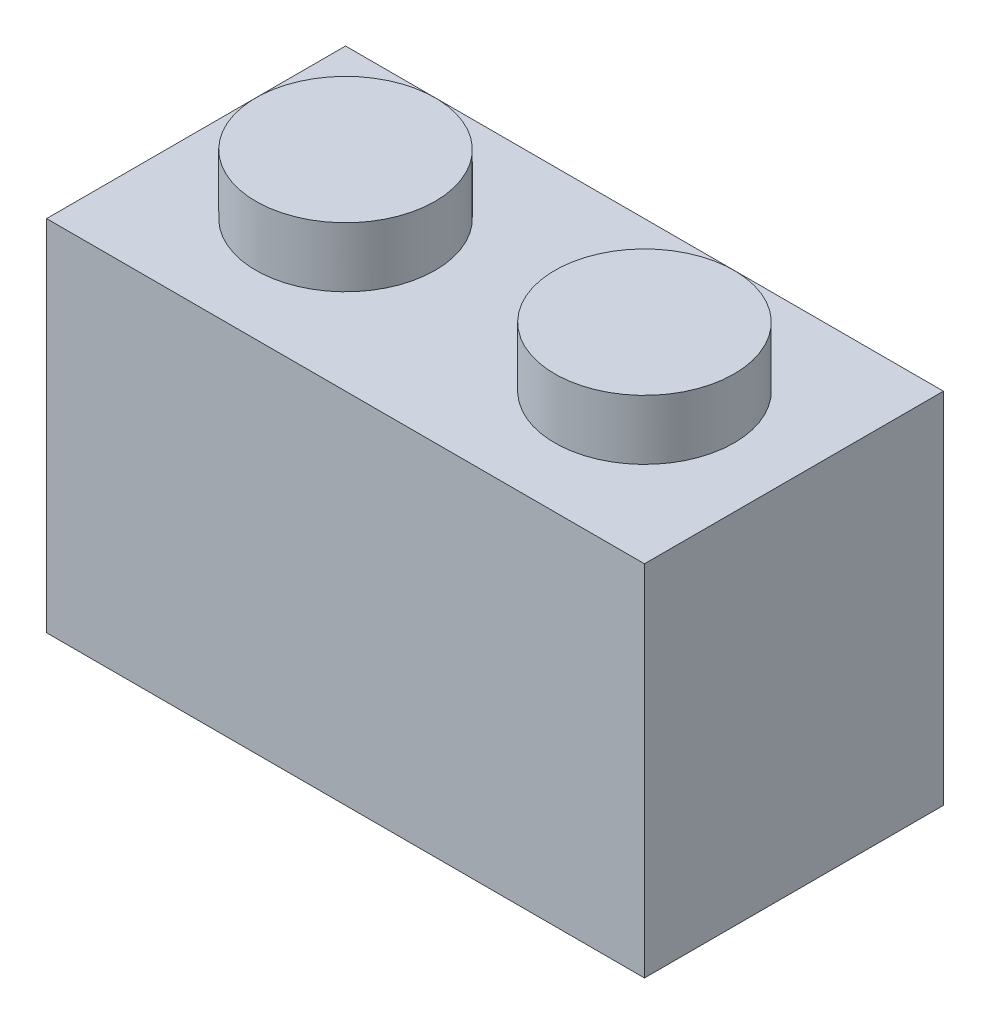
ISO-10303-21;
HEADER;
FILE_DESCRIPTION(('STEP AP214'),'2;1');
FILE_NAME('part.step','',(''),(''),'','','');
FILE_SCHEMA(('AUTOMOTIVE_DESIGN { 1 0 10303 214 1 1 1 1 }'));
ENDSEC;
DATA;
#1=APPLICATION_CONTEXT('core data for automotive mechanical design processes');
#2=APPLICATION_PROTOCOL_DEFINITION('international standard','automotive_design',2000,#1);
#3=PRODUCT_CONTEXT('',#1,'mechanical');
#4=PRODUCT('Part','Part','',(#3));
#5=PRODUCT_RELATED_PRODUCT_CATEGORY('part','',(#4));
#6=PRODUCT_DEFINITION_FORMATION('','',#4);
#7=PRODUCT_DEFINITION_CONTEXT('part definition',#1,'design');
#8=PRODUCT_DEFINITION('design','',#6,#7);
#9=PRODUCT_DEFINITION_SHAPE('','',#8);
#10=(LENGTH_UNIT() NAMED_UNIT(*) SI_UNIT(.MILLI.,.METRE.));
#11=(NAMED_UNIT(*) PLANE_ANGLE_UNIT() SI_UNIT($,.RADIAN.));
#12=(NAMED_UNIT(*) SI_UNIT($,.STERADIAN.) SOLID_ANGLE_UNIT());
#13=UNCERTAINTY_MEASURE_WITH_UNIT(LENGTH_MEASURE(1.E-05),#10,'distance_accuracy_value','');
#14=(GEOMETRIC_REPRESENTATION_CONTEXT(3) GLOBAL_UNCERTAINTY_ASSIGNED_CONTEXT((#13)) GLOBAL_UNIT_ASSIGNED_CONTEXT((#10,
#11,#12)) REPRESENTATION_CONTEXT('',''));
#15=CARTESIAN_POINT('',(0.,0.,0.));
#16=DIRECTION('',(0.,0.,1.));
#17=DIRECTION('',(1.,0.,0.));
#18=AXIS2_PLACEMENT_3D('',#15,#16,#17);
#19=CARTESIAN_POINT('',(12.,4.8,0.));
#20=DIRECTION('',(-1.,0.,0.));
#21=DIRECTION('',(0.,0.,1.));
#22=AXIS2_PLACEMENT_3D('',#19,#20,#21);
#23=PLANE('',#22);
#24=DIRECTION('',(0.,0.,-1.));
#25=VECTOR('',#24,1.);
#26=CARTESIAN_POINT('',(12.,0.,0.));
#27=LINE('',#26,#25);
#28=CARTESIAN_POINT('',(12.,0.,4.));
#29=VERTEX_POINT('',#28);
#30=CARTESIAN_POINT('',(12.,0.,-4.));
#31=VERTEX_POINT('',#30);
#32=EDGE_CURVE('E98',#29,#31,#27,.T.);
#33=ORIENTED_EDGE('',*,*,#32,.T.);
#34=DIRECTION('',(0.,-1.,0.));
#35=VECTOR('',#34,1.);
#36=CARTESIAN_POINT('',(12.,4.8,-4.));
#37=LINE('',#36,#35);
#38=CARTESIAN_POINT('',(12.,9.6,-4.));
#39=VERTEX_POINT('',#38);
#40=EDGE_CURVE('E111',#39,#31,#37,.T.);
#41=ORIENTED_EDGE('',*,*,#40,.F.);
#42=DIRECTION('',(0.,0.,-1.));
#43=VECTOR('',#42,1.);
#44=CARTESIAN_POINT('',(12.,9.6,0.));
#45=LINE('',#44,#43);
#46=CARTESIAN_POINT('',(12.,9.6,4.));
#47=VERTEX_POINT('',#46);
#48=EDGE_CURVE('E11',#47,#39,#45,.T.);
#49=ORIENTED_EDGE('',*,*,#48,.F.);
#50=DIRECTION('',(0.,1.,0.));
#51=VECTOR('',#50,1.);
#52=CARTESIAN_POINT('',(12.,4.8,4.));
#53=LINE('',#52,#51);
#54=EDGE_CURVE('E93',#29,#47,#53,.T.);
#55=ORIENTED_EDGE('',*,*,#54,.F.);
#56=EDGE_LOOP('',(#33,#41,#49,#55));
#57=FACE_BOUND('',#56,.T.);
#58=ADVANCED_FACE('F17',(#57),#23,.F.);
#59=CARTESIAN_POINT('',(4.,9.6,0.));
#60=DIRECTION('',(0.,-1.,0.));
#61=DIRECTION('',(0.,0.,-1.));
#62=AXIS2_PLACEMENT_3D('',#59,#60,#61);
#63=PLANE('',#62);
#64=ORIENTED_EDGE('',*,*,#48,.T.);
#65=DIRECTION('',(1.,0.,0.));
#66=VECTOR('',#65,1.);
#67=CARTESIAN_POINT('',(4.,9.6,-4.));
#68=LINE('',#67,#66);
#69=CARTESIAN_POINT('',(-4.,9.6,-4.));
#70=VERTEX_POINT('',#69);
#71=EDGE_CURVE('E103',#70,#39,#68,.T.);
#72=ORIENTED_EDGE('',*,*,#71,.F.);
#73=DIRECTION('',(0.,0.,-1.));
#74=VECTOR('',#73,1.);
#75=CARTESIAN_POINT('',(-4.,9.6,0.));
#76=LINE('',#75,#74);
#77=CARTESIAN_POINT('',(-4.,9.6,4.));
#78=VERTEX_POINT('',#77);
#79=EDGE_CURVE('E27',#78,#70,#76,.T.);
#80=ORIENTED_EDGE('',*,*,#79,.F.);
#81=DIRECTION('',(-1.,0.,0.));
#82=VECTOR('',#81,1.);
#83=CARTESIAN_POINT('',(4.,9.6,4.));
#84=LINE('',#83,#82);
#85=EDGE_CURVE('E118',#47,#78,#84,.T.);
#86=ORIENTED_EDGE('',*,*,#85,.F.);
#87=EDGE_LOOP('',(#64,#72,#80,#86));
#88=FACE_BOUND('',#87,.T.);
#89=CARTESIAN_POINT('',(0.,9.6,0.));
#90=DIRECTION('',(0.,-1.,0.));
#91=DIRECTION('',(1.,0.,0.));
#92=AXIS2_PLACEMENT_3D('',#89,#90,#91);
#93=CIRCLE('',#92,2.4);
#94=CARTESIAN_POINT('',(-2.4,9.6,0.));
#95=VERTEX_POINT('',#94);
#96=EDGE_CURVE('E91',#95,#95,#93,.T.);
#97=ORIENTED_EDGE('',*,*,#96,.T.);
#98=EDGE_LOOP('',(#97));
#99=FACE_BOUND('',#98,.T.);
#100=CARTESIAN_POINT('',(8.,9.6,0.));
#101=DIRECTION('',(0.,-1.,0.));
#102=DIRECTION('',(1.,0.,0.));
#103=AXIS2_PLACEMENT_3D('',#100,#101,#102);
#104=CIRCLE('',#103,2.4);
#105=CARTESIAN_POINT('',(5.6,9.6,0.));
#106=VERTEX_POINT('',#105);
#107=EDGE_CURVE('E92',#106,#106,#104,.T.);
#108=ORIENTED_EDGE('',*,*,#107,.T.);
#109=EDGE_LOOP('',(#108));
#110=FACE_BOUND('',#109,.T.);
#111=ADVANCED_FACE('F138',(#88,#99,#110),#63,.F.);
#112=CARTESIAN_POINT('',(-4.,4.8,0.));
#113=DIRECTION('',(1.,0.,0.));
#114=DIRECTION('',(0.,0.,-1.));
#115=AXIS2_PLACEMENT_3D('',#112,#113,#114);
#116=PLANE('',#115);
#117=ORIENTED_EDGE('',*,*,#79,.T.);
#118=DIRECTION('',(0.,1.,0.));
#119=VECTOR('',#118,1.);
#120=CARTESIAN_POINT('',(-4.,4.8,-4.));
#121=LINE('',#120,#119);
#122=CARTESIAN_POINT('',(-4.,0.,-4.));
#123=VERTEX_POINT('',#122);
#124=EDGE_CURVE('E107',#123,#70,#121,.T.);
#125=ORIENTED_EDGE('',*,*,#124,.F.);
#126=DIRECTION('',(0.,0.,-1.));
#127=VECTOR('',#126,1.);
#128=CARTESIAN_POINT('',(-4.,0.,0.));
#129=LINE('',#128,#127);
#130=CARTESIAN_POINT('',(-4.,0.,4.));
#131=VERTEX_POINT('',#130);
#132=EDGE_CURVE('E106',#131,#123,#129,.T.);
#133=ORIENTED_EDGE('',*,*,#132,.F.);
#134=DIRECTION('',(0.,-1.,0.));
#135=VECTOR('',#134,1.);
#136=CARTESIAN_POINT('',(-4.,4.8,4.));
#137=LINE('',#136,#135);
#138=EDGE_CURVE('E115',#78,#131,#137,.T.);
#139=ORIENTED_EDGE('',*,*,#138,.F.);
#140=EDGE_LOOP('',(#117,#125,#133,#139));
#141=FACE_BOUND('',#140,.T.);
#142=ADVANCED_FACE('F142',(#141),#116,.F.);
#143=CARTESIAN_POINT('',(4.,0.,0.));
#144=DIRECTION('',(0.,1.,0.));
#145=DIRECTION('',(0.,0.,1.));
#146=AXIS2_PLACEMENT_3D('',#143,#144,#145);
#147=PLANE('',#146);
#148=ORIENTED_EDGE('',*,*,#132,.T.);
#149=DIRECTION('',(-1.,0.,0.));
#150=VECTOR('',#149,1.);
#151=CARTESIAN_POINT('',(4.,0.,-4.));
#152=LINE('',#151,#150);
#153=EDGE_CURVE('E108',#31,#123,#152,.T.);
#154=ORIENTED_EDGE('',*,*,#153,.F.);
#155=ORIENTED_EDGE('',*,*,#32,.F.);
#156=DIRECTION('',(1.,0.,0.));
#157=VECTOR('',#156,1.);
#158=CARTESIAN_POINT('',(4.,0.,4.));
#159=LINE('',#158,#157);
#160=EDGE_CURVE('E112',#131,#29,#159,.T.);
#161=ORIENTED_EDGE('',*,*,#160,.F.);
#162=EDGE_LOOP('',(#148,#154,#155,#161));
#163=FACE_BOUND('',#162,.T.);
#164=CARTESIAN_POINT('',(0.,0.,0.));
#165=DIRECTION('',(0.,1.,0.));
#166=DIRECTION('',(1.,0.,0.));
#167=AXIS2_PLACEMENT_3D('',#164,#165,#166);
#168=CIRCLE('',#167,2.4);
#169=CARTESIAN_POINT('',(-2.4,0.,0.));
#170=VERTEX_POINT('',#169);
#171=EDGE_CURVE('E100',#170,#170,#168,.T.);
#172=ORIENTED_EDGE('',*,*,#171,.T.);
#173=EDGE_LOOP('',(#172));
#174=FACE_BOUND('',#173,.T.);
#175=CARTESIAN_POINT('',(8.,0.,0.));
#176=DIRECTION('',(0.,1.,0.));
#177=DIRECTION('',(1.,0.,0.));
#178=AXIS2_PLACEMENT_3D('',#175,#176,#177);
#179=CIRCLE('',#178,2.4);
#180=CARTESIAN_POINT('',(5.6,0.,0.));
#181=VERTEX_POINT('',#180);
#182=EDGE_CURVE('E119',#181,#181,#179,.T.);
#183=ORIENTED_EDGE('',*,*,#182,.T.);
#184=EDGE_LOOP('',(#183));
#185=FACE_BOUND('',#184,.T.);
#186=ADVANCED_FACE('F134',(#163,#174,#185),#147,.F.);
#187=CARTESIAN_POINT('',(4.,4.8,-4.));
#188=DIRECTION('',(0.,0.,1.));
#189=DIRECTION('',(1.,0.,0.));
#190=AXIS2_PLACEMENT_3D('',#187,#188,#189);
#191=PLANE('',#190);
#192=ORIENTED_EDGE('',*,*,#40,.T.);
#193=ORIENTED_EDGE('',*,*,#153,.T.);
#194=ORIENTED_EDGE('',*,*,#124,.T.);
#195=ORIENTED_EDGE('',*,*,#71,.T.);
#196=EDGE_LOOP('',(#192,#193,#194,#195));
#197=FACE_BOUND('',#196,.T.);
#198=ADVANCED_FACE('F137',(#197),#191,.F.);
#199=CARTESIAN_POINT('',(4.,4.8,4.));
#200=DIRECTION('',(0.,0.,1.));
#201=DIRECTION('',(1.,0.,0.));
#202=AXIS2_PLACEMENT_3D('',#199,#200,#201);
#203=PLANE('',#202);
#204=ORIENTED_EDGE('',*,*,#54,.T.);
#205=ORIENTED_EDGE('',*,*,#85,.T.);
#206=ORIENTED_EDGE('',*,*,#138,.T.);
#207=ORIENTED_EDGE('',*,*,#160,.T.);
#208=EDGE_LOOP('',(#204,#205,#206,#207));
#209=FACE_BOUND('',#208,.T.);
#210=ADVANCED_FACE('F141',(#209),#203,.T.);
#211=CARTESIAN_POINT('',(0.,11.2,0.));
#212=DIRECTION('',(0.,1.,0.));
#213=DIRECTION('',(1.,0.,0.));
#214=AXIS2_PLACEMENT_3D('',#211,#212,#213);
#215=PLANE('',#214);
#216=CARTESIAN_POINT('',(0.,11.2,0.));
#217=DIRECTION('',(0.,1.,0.));
#218=DIRECTION('',(1.,0.,0.));
#219=AXIS2_PLACEMENT_3D('',#216,#217,#218);
#220=CIRCLE('',#219,2.4);
#221=CARTESIAN_POINT('',(2.4,11.2,0.));
#222=VERTEX_POINT('',#221);
#223=EDGE_CURVE('E88',#222,#222,#220,.T.);
#224=ORIENTED_EDGE('',*,*,#223,.T.);
#225=EDGE_LOOP('',(#224));
#226=FACE_BOUND('',#225,.T.);
#227=ADVANCED_FACE('F89',(#226),#215,.T.);
#228=CARTESIAN_POINT('',(0.,10.15,0.));
#229=DIRECTION('',(0.,-1.,0.));
#230=DIRECTION('',(1.,0.,0.));
#231=AXIS2_PLACEMENT_3D('',#228,#229,#230);
#232=CYLINDRICAL_SURFACE('',#231,2.4);
#233=ORIENTED_EDGE('',*,*,#96,.F.);
#234=EDGE_LOOP('',(#233));
#235=FACE_BOUND('',#234,.T.);
#236=ORIENTED_EDGE('',*,*,#223,.F.);
#237=EDGE_LOOP('',(#236));
#238=FACE_BOUND('',#237,.T.);
#239=ADVANCED_FACE('F158',(#235,#238),#232,.T.);
#240=CARTESIAN_POINT('',(8.,11.2,0.));
#241=DIRECTION('',(0.,1.,0.));
#242=DIRECTION('',(1.,0.,0.));
#243=AXIS2_PLACEMENT_3D('',#240,#241,#242);
#244=PLANE('',#243);
#245=CARTESIAN_POINT('',(8.,11.2,0.));
#246=DIRECTION('',(0.,1.,0.));
#247=DIRECTION('',(1.,0.,0.));
#248=AXIS2_PLACEMENT_3D('',#245,#246,#247);
#249=CIRCLE('',#248,2.4);
#250=CARTESIAN_POINT('',(10.4,11.2,0.));
#251=VERTEX_POINT('',#250);
#252=EDGE_CURVE('E82',#251,#251,#249,.T.);
#253=ORIENTED_EDGE('',*,*,#252,.T.);
#254=EDGE_LOOP('',(#253));
#255=FACE_BOUND('',#254,.T.);
#256=ADVANCED_FACE('F19',(#255),#244,.T.);
#257=CARTESIAN_POINT('',(8.,10.15,0.));
#258=DIRECTION('',(0.,-1.,0.));
#259=DIRECTION('',(1.,0.,0.));
#260=AXIS2_PLACEMENT_3D('',#257,#258,#259);
#261=CYLINDRICAL_SURFACE('',#260,2.4);
#262=ORIENTED_EDGE('',*,*,#107,.F.);
#263=EDGE_LOOP('',(#262));
#264=FACE_BOUND('',#263,.T.);
#265=ORIENTED_EDGE('',*,*,#252,.F.);
#266=EDGE_LOOP('',(#265));
#267=FACE_BOUND('',#266,.T.);
#268=ADVANCED_FACE('F162',(#264,#267),#261,.T.);
#269=CARTESIAN_POINT('',(0.,1.6,0.));
#270=DIRECTION('',(0.,1.,0.));
#271=DIRECTION('',(1.,0.,0.));
#272=AXIS2_PLACEMENT_3D('',#269,#270,#271);
#273=PLANE('',#272);
#274=CARTESIAN_POINT('',(0.,1.6,0.));
#275=DIRECTION('',(0.,1.,0.));
#276=DIRECTION('',(1.,0.,0.));
#277=AXIS2_PLACEMENT_3D('',#274,#275,#276);
#278=CIRCLE('',#277,2.4);
#279=CARTESIAN_POINT('',(2.4,1.6,0.));
#280=VERTEX_POINT('',#279);
#281=EDGE_CURVE('E21',#280,#280,#278,.T.);
#282=ORIENTED_EDGE('',*,*,#281,.F.);
#283=EDGE_LOOP('',(#282));
#284=FACE_BOUND('',#283,.T.);
#285=ADVANCED_FACE('F165',(#284),#273,.F.);
#286=CARTESIAN_POINT('',(0.,0.55,0.));
#287=DIRECTION('',(0.,-1.,0.));
#288=DIRECTION('',(1.,0.,0.));
#289=AXIS2_PLACEMENT_3D('',#286,#287,#288);
#290=CYLINDRICAL_SURFACE('',#289,2.4);
#291=ORIENTED_EDGE('',*,*,#281,.T.);
#292=EDGE_LOOP('',(#291));
#293=FACE_BOUND('',#292,.T.);
#294=ORIENTED_EDGE('',*,*,#171,.F.);
#295=EDGE_LOOP('',(#294));
#296=FACE_BOUND('',#295,.T.);
#297=ADVANCED_FACE('F176',(#293,#296),#290,.F.);
#298=CARTESIAN_POINT('',(8.,1.6,0.));
#299=DIRECTION('',(0.,1.,0.));
#300=DIRECTION('',(1.,0.,0.));
#301=AXIS2_PLACEMENT_3D('',#298,#299,#300);
#302=PLANE('',#301);
#303=CARTESIAN_POINT('',(8.,1.6,0.));
#304=DIRECTION('',(0.,1.,0.));
#305=DIRECTION('',(1.,0.,0.));
#306=AXIS2_PLACEMENT_3D('',#303,#304,#305);
#307=CIRCLE('',#306,2.4);
#308=CARTESIAN_POINT('',(10.4,1.6,0.));
#309=VERTEX_POINT('',#308);
#310=EDGE_CURVE('E102',#309,#309,#307,.T.);
#311=ORIENTED_EDGE('',*,*,#310,.F.);
#312=EDGE_LOOP('',(#311));
#313=FACE_BOUND('',#312,.T.);
#314=ADVANCED_FACE('F170',(#313),#302,.F.);
#315=CARTESIAN_POINT('',(8.,0.55,0.));
#316=DIRECTION('',(0.,-1.,0.));
#317=DIRECTION('',(1.,0.,0.));
#318=AXIS2_PLACEMENT_3D('',#315,#316,#317);
#319=CYLINDRICAL_SURFACE('',#318,2.4);
#320=ORIENTED_EDGE('',*,*,#310,.T.);
#321=EDGE_LOOP('',(#320));
#322=FACE_BOUND('',#321,.T.);
#323=ORIENTED_EDGE('',*,*,#182,.F.);
#324=EDGE_LOOP('',(#323));
#325=FACE_BOUND('',#324,.T.);
#326=ADVANCED_FACE('F167',(#322,#325),#319,.F.);
#327=CLOSED_SHELL('',(#58,#111,#142,#186,#198,#210,#227,#239,#256,#268,#285,#297,#314,#326));
#328=MANIFOLD_SOLID_BREP('B1',#327);
#329=ADVANCED_BREP_SHAPE_REPRESENTATION('',(#18,#328),#14);
#330=SHAPE_DEFINITION_REPRESENTATION(#9,#329);
ENDSEC;
END-ISO-10303-21;
